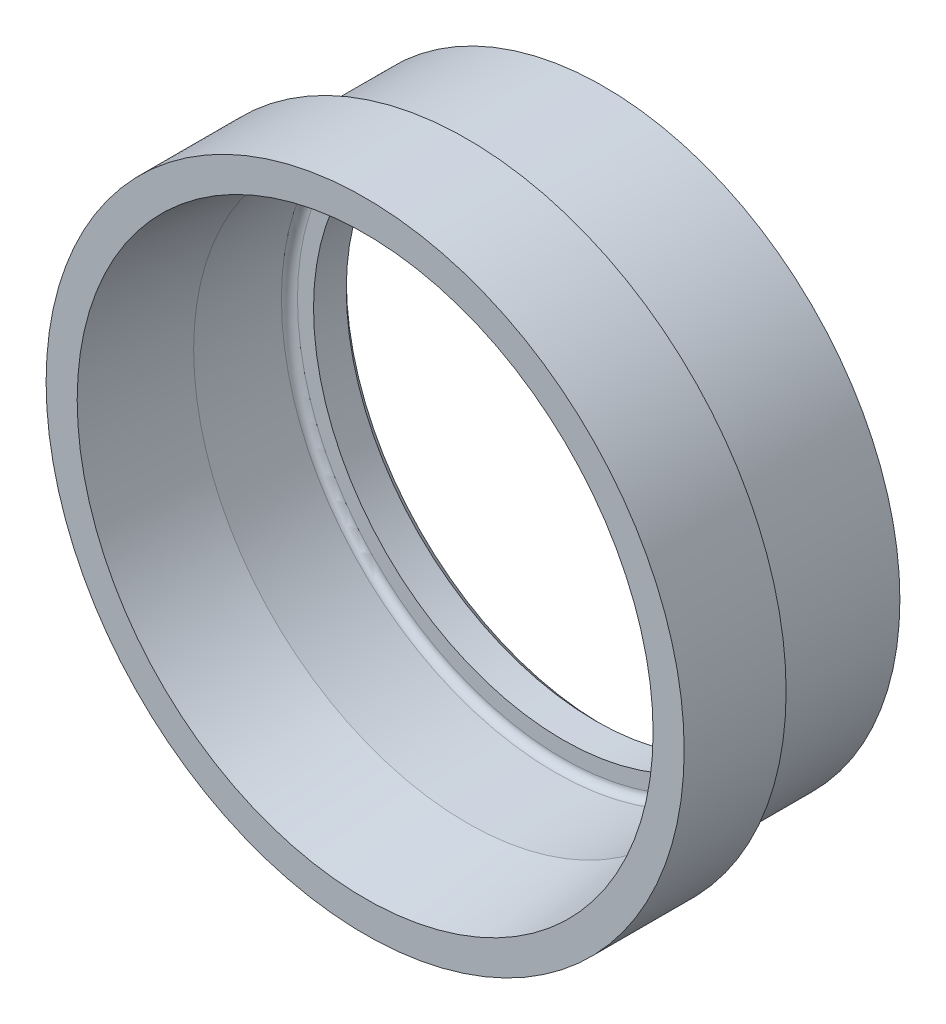
ISO-10303-21;
HEADER;
FILE_DESCRIPTION(('STEP AP214'),'2;1');
FILE_NAME('part.step','',(''),(''),'','','');
FILE_SCHEMA(('AUTOMOTIVE_DESIGN { 1 0 10303 214 1 1 1 1 }'));
ENDSEC;
DATA;
#1=APPLICATION_CONTEXT('core data for automotive mechanical design processes');
#2=APPLICATION_PROTOCOL_DEFINITION('international standard','automotive_design',2000,#1);
#3=PRODUCT_CONTEXT('',#1,'mechanical');
#4=PRODUCT('Part','Part','',(#3));
#5=PRODUCT_RELATED_PRODUCT_CATEGORY('part','',(#4));
#6=PRODUCT_DEFINITION_FORMATION('','',#4);
#7=PRODUCT_DEFINITION_CONTEXT('part definition',#1,'design');
#8=PRODUCT_DEFINITION('design','',#6,#7);
#9=PRODUCT_DEFINITION_SHAPE('','',#8);
#10=(LENGTH_UNIT() NAMED_UNIT(*) SI_UNIT(.MILLI.,.METRE.));
#11=(NAMED_UNIT(*) PLANE_ANGLE_UNIT() SI_UNIT($,.RADIAN.));
#12=(NAMED_UNIT(*) SI_UNIT($,.STERADIAN.) SOLID_ANGLE_UNIT());
#13=UNCERTAINTY_MEASURE_WITH_UNIT(LENGTH_MEASURE(1.E-05),#10,'distance_accuracy_value','');
#14=(GEOMETRIC_REPRESENTATION_CONTEXT(3) GLOBAL_UNCERTAINTY_ASSIGNED_CONTEXT((#13)) GLOBAL_UNIT_ASSIGNED_CONTEXT((#10,
#11,#12)) REPRESENTATION_CONTEXT('',''));
#15=CARTESIAN_POINT('',(0.,0.,0.));
#16=DIRECTION('',(0.,0.,1.));
#17=DIRECTION('',(1.,0.,0.));
#18=AXIS2_PLACEMENT_3D('',#15,#16,#17);
#19=CARTESIAN_POINT('',(0.,0.,0.));
#20=DIRECTION('',(0.,0.,1.));
#21=DIRECTION('',(1.,0.,0.));
#22=AXIS2_PLACEMENT_3D('',#19,#20,#21);
#23=CYLINDRICAL_SURFACE('',#22,34.0681964281124);
#24=CARTESIAN_POINT('',(0.,0.,-23.638));
#25=DIRECTION('',(0.,0.,1.));
#26=DIRECTION('',(1.,0.,0.));
#27=AXIS2_PLACEMENT_3D('',#24,#25,#26);
#28=CIRCLE('',#27,34.0681964281124);
#29=CARTESIAN_POINT('',(34.0681964281124,0.,-23.638));
#30=VERTEX_POINT('',#29);
#31=EDGE_CURVE('E10',#30,#30,#28,.F.);
#32=ORIENTED_EDGE('',*,*,#31,.T.);
#33=EDGE_LOOP('',(#32));
#34=FACE_BOUND('',#33,.T.);
#35=CARTESIAN_POINT('',(0.,0.,-12.7));
#36=DIRECTION('',(0.,0.,1.));
#37=DIRECTION('',(1.,0.,0.));
#38=AXIS2_PLACEMENT_3D('',#35,#36,#37);
#39=CIRCLE('',#38,34.0681964281124);
#40=CARTESIAN_POINT('',(34.0681964281124,0.,-12.7));
#41=VERTEX_POINT('',#40);
#42=EDGE_CURVE('E79',#41,#41,#39,.T.);
#43=ORIENTED_EDGE('',*,*,#42,.T.);
#44=EDGE_LOOP('',(#43));
#45=FACE_BOUND('',#44,.T.);
#46=ADVANCED_FACE('F47',(#34,#45),#23,.F.);
#47=CARTESIAN_POINT('',(0.,0.,-12.7));
#48=DIRECTION('',(0.,0.,1.));
#49=DIRECTION('',(1.,0.,0.));
#50=AXIS2_PLACEMENT_3D('',#47,#48,#49);
#51=CONICAL_SURFACE('',#50,34.0681964281124,0.141512584724062);
#52=CARTESIAN_POINT('',(0.,0.,0.));
#53=DIRECTION('',(0.,0.,1.));
#54=DIRECTION('',(1.,0.,0.));
#55=AXIS2_PLACEMENT_3D('',#52,#53,#54);
#56=CIRCLE('',#55,35.8775);
#57=CARTESIAN_POINT('',(35.8775,0.,0.));
#58=VERTEX_POINT('',#57);
#59=EDGE_CURVE('E83',#58,#58,#56,.T.);
#60=ORIENTED_EDGE('',*,*,#59,.T.);
#61=EDGE_LOOP('',(#60));
#62=FACE_BOUND('',#61,.T.);
#63=ORIENTED_EDGE('',*,*,#42,.F.);
#64=EDGE_LOOP('',(#63));
#65=FACE_BOUND('',#64,.T.);
#66=ADVANCED_FACE('F122',(#62,#65),#51,.F.);
#67=CARTESIAN_POINT('',(0.,0.,0.));
#68=DIRECTION('',(0.,0.,1.));
#69=DIRECTION('',(1.,0.,0.));
#70=AXIS2_PLACEMENT_3D('',#67,#68,#69);
#71=PLANE('',#70);
#72=CARTESIAN_POINT('',(0.,0.,0.));
#73=DIRECTION('',(0.,0.,1.));
#74=DIRECTION('',(1.,0.,0.));
#75=AXIS2_PLACEMENT_3D('',#72,#73,#74);
#76=CIRCLE('',#75,39.751);
#77=CARTESIAN_POINT('',(39.751,0.,0.));
#78=VERTEX_POINT('',#77);
#79=EDGE_CURVE('E87',#78,#78,#76,.T.);
#80=ORIENTED_EDGE('',*,*,#79,.T.);
#81=EDGE_LOOP('',(#80));
#82=FACE_BOUND('',#81,.T.);
#83=ORIENTED_EDGE('',*,*,#59,.F.);
#84=EDGE_LOOP('',(#83));
#85=FACE_BOUND('',#84,.T.);
#86=ADVANCED_FACE('F128',(#82,#85),#71,.T.);
#87=CARTESIAN_POINT('',(0.,0.,0.));
#88=DIRECTION('',(0.,0.,1.));
#89=DIRECTION('',(1.,0.,0.));
#90=AXIS2_PLACEMENT_3D('',#87,#88,#89);
#91=CYLINDRICAL_SURFACE('',#90,39.751);
#92=CARTESIAN_POINT('',(0.,0.,-12.7));
#93=DIRECTION('',(0.,0.,1.));
#94=DIRECTION('',(1.,0.,0.));
#95=AXIS2_PLACEMENT_3D('',#92,#93,#94);
#96=CIRCLE('',#95,39.751);
#97=CARTESIAN_POINT('',(39.751,0.,-12.7));
#98=VERTEX_POINT('',#97);
#99=EDGE_CURVE('E91',#98,#98,#96,.T.);
#100=ORIENTED_EDGE('',*,*,#99,.T.);
#101=EDGE_LOOP('',(#100));
#102=FACE_BOUND('',#101,.T.);
#103=ORIENTED_EDGE('',*,*,#79,.F.);
#104=EDGE_LOOP('',(#103));
#105=FACE_BOUND('',#104,.T.);
#106=ADVANCED_FACE('F157',(#102,#105),#91,.T.);
#107=CARTESIAN_POINT('',(0.,0.,-12.7));
#108=DIRECTION('',(0.,0.,-1.));
#109=DIRECTION('',(-1.,0.,0.));
#110=AXIS2_PLACEMENT_3D('',#107,#108,#109);
#111=PLANE('',#110);
#112=CARTESIAN_POINT('',(0.,0.,-12.7));
#113=DIRECTION('',(0.,0.,-1.));
#114=DIRECTION('',(-1.,0.,0.));
#115=AXIS2_PLACEMENT_3D('',#112,#113,#114);
#116=CIRCLE('',#115,37.9101964281124);
#117=CARTESIAN_POINT('',(-37.9101964281124,0.,-12.7));
#118=VERTEX_POINT('',#117);
#119=EDGE_CURVE('E75',#118,#118,#116,.F.);
#120=ORIENTED_EDGE('',*,*,#119,.T.);
#121=EDGE_LOOP('',(#120));
#122=FACE_BOUND('',#121,.T.);
#123=ORIENTED_EDGE('',*,*,#99,.F.);
#124=EDGE_LOOP('',(#123));
#125=FACE_BOUND('',#124,.T.);
#126=ADVANCED_FACE('F151',(#122,#125),#111,.T.);
#127=CARTESIAN_POINT('',(0.,0.,0.));
#128=DIRECTION('',(0.,0.,1.));
#129=DIRECTION('',(1.,0.,0.));
#130=AXIS2_PLACEMENT_3D('',#127,#128,#129);
#131=CYLINDRICAL_SURFACE('',#130,36.9101964281124);
#132=CARTESIAN_POINT('',(0.,0.,-13.7));
#133=DIRECTION('',(0.,0.,-1.));
#134=DIRECTION('',(-1.,0.,0.));
#135=AXIS2_PLACEMENT_3D('',#132,#133,#134);
#136=CIRCLE('',#135,36.9101964281124);
#137=CARTESIAN_POINT('',(-36.9101964281124,0.,-13.7));
#138=VERTEX_POINT('',#137);
#139=EDGE_CURVE('E71',#138,#138,#136,.T.);
#140=ORIENTED_EDGE('',*,*,#139,.T.);
#141=EDGE_LOOP('',(#140));
#142=FACE_BOUND('',#141,.T.);
#143=CARTESIAN_POINT('',(0.,0.,-29.718));
#144=DIRECTION('',(0.,0.,1.));
#145=DIRECTION('',(1.,0.,0.));
#146=AXIS2_PLACEMENT_3D('',#143,#144,#145);
#147=CIRCLE('',#146,36.9101964281124);
#148=CARTESIAN_POINT('',(36.9101964281124,0.,-29.718));
#149=VERTEX_POINT('',#148);
#150=EDGE_CURVE('E95',#149,#149,#147,.T.);
#151=ORIENTED_EDGE('',*,*,#150,.T.);
#152=EDGE_LOOP('',(#151));
#153=FACE_BOUND('',#152,.T.);
#154=ADVANCED_FACE('F146',(#142,#153),#131,.T.);
#155=CARTESIAN_POINT('',(0.,0.,-29.718));
#156=DIRECTION('',(0.,0.,-1.));
#157=DIRECTION('',(-1.,0.,0.));
#158=AXIS2_PLACEMENT_3D('',#155,#156,#157);
#159=PLANE('',#158);
#160=CARTESIAN_POINT('',(0.,0.,-29.718));
#161=DIRECTION('',(0.,0.,-1.));
#162=DIRECTION('',(-1.,0.,0.));
#163=AXIS2_PLACEMENT_3D('',#160,#161,#162);
#164=CIRCLE('',#163,32.0681964281124);
#165=CARTESIAN_POINT('',(-32.0681964281124,0.,-29.718));
#166=VERTEX_POINT('',#165);
#167=EDGE_CURVE('E65',#166,#166,#164,.F.);
#168=ORIENTED_EDGE('',*,*,#167,.T.);
#169=EDGE_LOOP('',(#168));
#170=FACE_BOUND('',#169,.T.);
#171=ORIENTED_EDGE('',*,*,#150,.F.);
#172=EDGE_LOOP('',(#171));
#173=FACE_BOUND('',#172,.T.);
#174=ADVANCED_FACE('F119',(#170,#173),#159,.T.);
#175=CARTESIAN_POINT('',(0.,0.,0.));
#176=DIRECTION('',(0.,0.,1.));
#177=DIRECTION('',(1.,0.,0.));
#178=AXIS2_PLACEMENT_3D('',#175,#176,#177);
#179=CYLINDRICAL_SURFACE('',#178,31.0681964281124);
#180=CARTESIAN_POINT('',(0.,0.,-28.718));
#181=DIRECTION('',(0.,0.,-1.));
#182=DIRECTION('',(-1.,0.,0.));
#183=AXIS2_PLACEMENT_3D('',#180,#181,#182);
#184=CIRCLE('',#183,31.0681964281124);
#185=CARTESIAN_POINT('',(-31.0681964281124,0.,-28.718));
#186=VERTEX_POINT('',#185);
#187=EDGE_CURVE('E60',#186,#186,#184,.T.);
#188=ORIENTED_EDGE('',*,*,#187,.T.);
#189=EDGE_LOOP('',(#188));
#190=FACE_BOUND('',#189,.T.);
#191=CARTESIAN_POINT('',(0.,0.,-24.638));
#192=DIRECTION('',(0.,0.,1.));
#193=DIRECTION('',(1.,0.,0.));
#194=AXIS2_PLACEMENT_3D('',#191,#192,#193);
#195=CIRCLE('',#194,31.0681964281124);
#196=CARTESIAN_POINT('',(31.0681964281124,0.,-24.638));
#197=VERTEX_POINT('',#196);
#198=EDGE_CURVE('E99',#197,#197,#195,.T.);
#199=ORIENTED_EDGE('',*,*,#198,.T.);
#200=EDGE_LOOP('',(#199));
#201=FACE_BOUND('',#200,.T.);
#202=ADVANCED_FACE('F104',(#190,#201),#179,.F.);
#203=CARTESIAN_POINT('',(0.,0.,-24.638));
#204=DIRECTION('',(0.,0.,1.));
#205=DIRECTION('',(1.,0.,0.));
#206=AXIS2_PLACEMENT_3D('',#203,#204,#205);
#207=PLANE('',#206);
#208=CARTESIAN_POINT('',(0.,0.,-24.638));
#209=DIRECTION('',(0.,0.,1.));
#210=DIRECTION('',(1.,0.,0.));
#211=AXIS2_PLACEMENT_3D('',#208,#209,#210);
#212=CIRCLE('',#211,33.0681964281124);
#213=CARTESIAN_POINT('',(33.0681964281124,0.,-24.638));
#214=VERTEX_POINT('',#213);
#215=EDGE_CURVE('E55',#214,#214,#212,.T.);
#216=ORIENTED_EDGE('',*,*,#215,.T.);
#217=EDGE_LOOP('',(#216));
#218=FACE_BOUND('',#217,.T.);
#219=ORIENTED_EDGE('',*,*,#198,.F.);
#220=EDGE_LOOP('',(#219));
#221=FACE_BOUND('',#220,.T.);
#222=ADVANCED_FACE('F106',(#218,#221),#207,.T.);
#223=CARTESIAN_POINT('',(0.,0.,-13.7));
#224=DIRECTION('',(0.,0.,-1.));
#225=DIRECTION('',(-1.,0.,0.));
#226=AXIS2_PLACEMENT_3D('',#223,#224,#225);
#227=TOROIDAL_SURFACE('',#226,37.9101964281124,1.);
#228=ORIENTED_EDGE('',*,*,#139,.F.);
#229=EDGE_LOOP('',(#228));
#230=FACE_BOUND('',#229,.T.);
#231=ORIENTED_EDGE('',*,*,#119,.F.);
#232=EDGE_LOOP('',(#231));
#233=FACE_BOUND('',#232,.T.);
#234=ADVANCED_FACE('F108',(#230,#233),#227,.F.);
#235=CARTESIAN_POINT('',(0.,0.,-29.718));
#236=DIRECTION('',(0.,0.,-1.));
#237=DIRECTION('',(-1.,0.,0.));
#238=AXIS2_PLACEMENT_3D('',#235,#236,#237);
#239=CONICAL_SURFACE('',#238,32.0681964281124,0.785398163397448);
#240=ORIENTED_EDGE('',*,*,#187,.F.);
#241=EDGE_LOOP('',(#240));
#242=FACE_BOUND('',#241,.T.);
#243=ORIENTED_EDGE('',*,*,#167,.F.);
#244=EDGE_LOOP('',(#243));
#245=FACE_BOUND('',#244,.T.);
#246=ADVANCED_FACE('F115',(#242,#245),#239,.F.);
#247=CARTESIAN_POINT('',(0.,0.,-23.638));
#248=DIRECTION('',(0.,0.,1.));
#249=DIRECTION('',(1.,0.,0.));
#250=AXIS2_PLACEMENT_3D('',#247,#248,#249);
#251=TOROIDAL_SURFACE('',#250,33.0681964281124,1.);
#252=ORIENTED_EDGE('',*,*,#31,.F.);
#253=EDGE_LOOP('',(#252));
#254=FACE_BOUND('',#253,.T.);
#255=ORIENTED_EDGE('',*,*,#215,.F.);
#256=EDGE_LOOP('',(#255));
#257=FACE_BOUND('',#256,.T.);
#258=ADVANCED_FACE('F49',(#254,#257),#251,.F.);
#259=CLOSED_SHELL('',(#46,#66,#86,#106,#126,#154,#174,#202,#222,#234,#246,#258));
#260=MANIFOLD_SOLID_BREP('B2',#259);
#261=ADVANCED_BREP_SHAPE_REPRESENTATION('',(#18,#260),#14);
#262=SHAPE_DEFINITION_REPRESENTATION(#9,#261);
ENDSEC;
END-ISO-10303-21;
